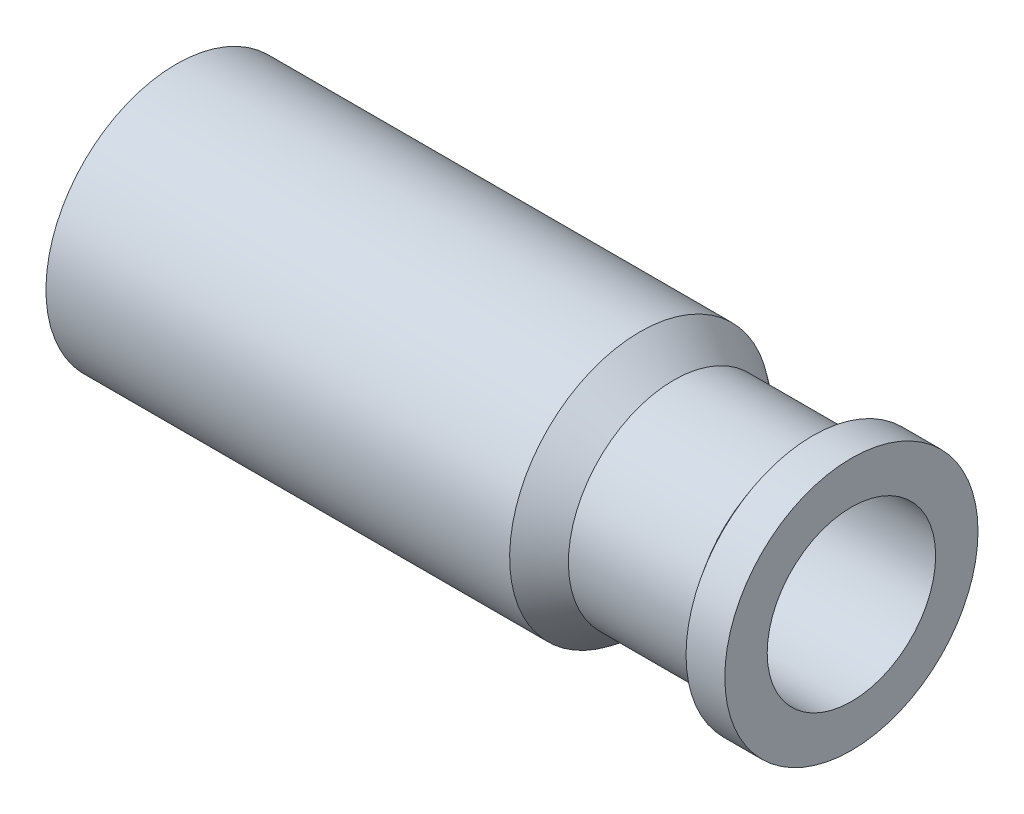
ISO-10303-21;
HEADER;
FILE_DESCRIPTION(('STEP AP214'),'2;1');
FILE_NAME('part.step','',(''),(''),'','','');
FILE_SCHEMA(('AUTOMOTIVE_DESIGN { 1 0 10303 214 1 1 1 1 }'));
ENDSEC;
DATA;
#1=APPLICATION_CONTEXT('core data for automotive mechanical design processes');
#2=APPLICATION_PROTOCOL_DEFINITION('international standard','automotive_design',2000,#1);
#3=PRODUCT_CONTEXT('',#1,'mechanical');
#4=PRODUCT('Part','Part','',(#3));
#5=PRODUCT_RELATED_PRODUCT_CATEGORY('part','',(#4));
#6=PRODUCT_DEFINITION_FORMATION('','',#4);
#7=PRODUCT_DEFINITION_CONTEXT('part definition',#1,'design');
#8=PRODUCT_DEFINITION('design','',#6,#7);
#9=PRODUCT_DEFINITION_SHAPE('','',#8);
#10=(LENGTH_UNIT() NAMED_UNIT(*) SI_UNIT(.MILLI.,.METRE.));
#11=(NAMED_UNIT(*) PLANE_ANGLE_UNIT() SI_UNIT($,.RADIAN.));
#12=(NAMED_UNIT(*) SI_UNIT($,.STERADIAN.) SOLID_ANGLE_UNIT());
#13=UNCERTAINTY_MEASURE_WITH_UNIT(LENGTH_MEASURE(1.E-05),#10,'distance_accuracy_value','');
#14=(GEOMETRIC_REPRESENTATION_CONTEXT(3) GLOBAL_UNCERTAINTY_ASSIGNED_CONTEXT((#13)) GLOBAL_UNIT_ASSIGNED_CONTEXT((#10,
#11,#12)) REPRESENTATION_CONTEXT('',''));
#15=CARTESIAN_POINT('',(0.,0.,0.));
#16=DIRECTION('',(0.,0.,1.));
#17=DIRECTION('',(1.,0.,0.));
#18=AXIS2_PLACEMENT_3D('',#15,#16,#17);
#19=CARTESIAN_POINT('',(171.145497315962,-55.1361493306223,0.));
#20=DIRECTION('',(1.,0.,0.));
#21=DIRECTION('',(0.,1.,0.));
#22=AXIS2_PLACEMENT_3D('',#19,#20,#21);
#23=CYLINDRICAL_SURFACE('',#22,39.2252237368823);
#24=CARTESIAN_POINT('',(-32.0545026840381,-55.1361493306223,0.));
#25=DIRECTION('',(1.,0.,0.));
#26=DIRECTION('',(0.,1.,0.));
#27=AXIS2_PLACEMENT_3D('',#24,#25,#26);
#28=CIRCLE('',#27,39.2252237368825);
#29=CARTESIAN_POINT('',(-32.0545026840381,-15.9109255937398,0.));
#30=VERTEX_POINT('',#29);
#31=EDGE_CURVE('E10',#30,#30,#28,.T.);
#32=ORIENTED_EDGE('',*,*,#31,.T.);
#33=EDGE_LOOP('',(#32));
#34=FACE_BOUND('',#33,.T.);
#35=CARTESIAN_POINT('',(107.503032850586,-55.1361493306223,0.));
#36=DIRECTION('',(1.,0.,0.));
#37=DIRECTION('',(0.,1.,0.));
#38=AXIS2_PLACEMENT_3D('',#35,#36,#37);
#39=CIRCLE('',#38,39.2252237368822);
#40=CARTESIAN_POINT('',(107.503032850586,-15.9109255937401,0.));
#41=VERTEX_POINT('',#40);
#42=EDGE_CURVE('E57',#41,#41,#39,.T.);
#43=ORIENTED_EDGE('',*,*,#42,.F.);
#44=EDGE_LOOP('',(#43));
#45=FACE_BOUND('',#44,.T.);
#46=ADVANCED_FACE('F35',(#34,#45),#23,.T.);
#47=CARTESIAN_POINT('',(-32.0545026840381,-15.9109255937398,0.));
#48=DIRECTION('',(-1.,0.,0.));
#49=DIRECTION('',(0.,-1.,0.));
#50=AXIS2_PLACEMENT_3D('',#47,#48,#49);
#51=PLANE('',#50);
#52=ORIENTED_EDGE('',*,*,#31,.F.);
#53=EDGE_LOOP('',(#52));
#54=FACE_BOUND('',#53,.T.);
#55=ADVANCED_FACE('F79',(#54),#51,.T.);
#56=CARTESIAN_POINT('',(171.145497315962,-17.0361493306223,0.));
#57=DIRECTION('',(1.,0.,0.));
#58=DIRECTION('',(0.,1.,0.));
#59=AXIS2_PLACEMENT_3D('',#56,#57,#58);
#60=PLANE('',#59);
#61=CARTESIAN_POINT('',(171.145497315962,-55.1361493306223,0.));
#62=DIRECTION('',(1.,0.,0.));
#63=DIRECTION('',(0.,1.,0.));
#64=AXIS2_PLACEMENT_3D('',#61,#62,#63);
#65=CIRCLE('',#64,25.3501248235923);
#66=CARTESIAN_POINT('',(171.145497315962,-29.7860245070299,0.));
#67=VERTEX_POINT('',#66);
#68=EDGE_CURVE('E61',#67,#67,#65,.T.);
#69=ORIENTED_EDGE('',*,*,#68,.F.);
#70=EDGE_LOOP('',(#69));
#71=FACE_BOUND('',#70,.T.);
#72=CARTESIAN_POINT('',(171.145497315962,-55.1361493306223,0.));
#73=DIRECTION('',(1.,0.,0.));
#74=DIRECTION('',(0.,1.,0.));
#75=AXIS2_PLACEMENT_3D('',#72,#73,#74);
#76=CIRCLE('',#75,38.1);
#77=CARTESIAN_POINT('',(171.145497315962,-17.0361493306223,0.));
#78=VERTEX_POINT('',#77);
#79=EDGE_CURVE('E41',#78,#78,#76,.T.);
#80=ORIENTED_EDGE('',*,*,#79,.T.);
#81=EDGE_LOOP('',(#80));
#82=FACE_BOUND('',#81,.T.);
#83=ADVANCED_FACE('F76',(#71,#82),#60,.T.);
#84=CARTESIAN_POINT('',(171.145497315962,-55.1361493306223,0.));
#85=DIRECTION('',(1.,0.,0.));
#86=DIRECTION('',(0.,1.,0.));
#87=AXIS2_PLACEMENT_3D('',#84,#85,#86);
#88=CYLINDRICAL_SURFACE('',#87,38.1);
#89=CARTESIAN_POINT('',(159.466804827145,-55.1361493306223,0.));
#90=DIRECTION('',(1.,0.,0.));
#91=DIRECTION('',(0.,1.,0.));
#92=AXIS2_PLACEMENT_3D('',#89,#90,#91);
#93=CIRCLE('',#92,38.1);
#94=CARTESIAN_POINT('',(159.466804827145,-17.0361493306223,0.));
#95=VERTEX_POINT('',#94);
#96=EDGE_CURVE('E45',#95,#95,#93,.T.);
#97=ORIENTED_EDGE('',*,*,#96,.T.);
#98=EDGE_LOOP('',(#97));
#99=FACE_BOUND('',#98,.T.);
#100=ORIENTED_EDGE('',*,*,#79,.F.);
#101=EDGE_LOOP('',(#100));
#102=FACE_BOUND('',#101,.T.);
#103=ADVANCED_FACE('F78',(#99,#102),#88,.T.);
#104=CARTESIAN_POINT('',(159.466804827145,-55.1361493306223,0.));
#105=DIRECTION('',(1.,0.,0.));
#106=DIRECTION('',(0.,1.,0.));
#107=AXIS2_PLACEMENT_3D('',#104,#105,#106);
#108=CONICAL_SURFACE('',#107,38.1,0.93892170214599);
#109=CARTESIAN_POINT('',(154.818669260434,-55.1361493306223,0.));
#110=DIRECTION('',(1.,0.,0.));
#111=DIRECTION('',(0.,1.,0.));
#112=AXIS2_PLACEMENT_3D('',#109,#110,#111);
#113=CIRCLE('',#112,31.75);
#114=CARTESIAN_POINT('',(154.818669260434,-23.3861493306223,0.));
#115=VERTEX_POINT('',#114);
#116=EDGE_CURVE('E49',#115,#115,#113,.T.);
#117=ORIENTED_EDGE('',*,*,#116,.T.);
#118=EDGE_LOOP('',(#117));
#119=FACE_BOUND('',#118,.T.);
#120=ORIENTED_EDGE('',*,*,#96,.F.);
#121=EDGE_LOOP('',(#120));
#122=FACE_BOUND('',#121,.T.);
#123=ADVANCED_FACE('F85',(#119,#122),#108,.T.);
#124=CARTESIAN_POINT('',(171.145497315962,-55.1361493306223,0.));
#125=DIRECTION('',(1.,0.,0.));
#126=DIRECTION('',(0.,1.,0.));
#127=AXIS2_PLACEMENT_3D('',#124,#125,#126);
#128=CYLINDRICAL_SURFACE('',#127,31.75);
#129=CARTESIAN_POINT('',(117.715228697274,-55.1361493306223,0.));
#130=DIRECTION('',(1.,0.,0.));
#131=DIRECTION('',(0.,1.,0.));
#132=AXIS2_PLACEMENT_3D('',#129,#130,#131);
#133=CIRCLE('',#132,31.75);
#134=CARTESIAN_POINT('',(117.715228697274,-23.3861493306223,0.));
#135=VERTEX_POINT('',#134);
#136=EDGE_CURVE('E54',#135,#135,#133,.T.);
#137=ORIENTED_EDGE('',*,*,#136,.T.);
#138=EDGE_LOOP('',(#137));
#139=FACE_BOUND('',#138,.T.);
#140=ORIENTED_EDGE('',*,*,#116,.F.);
#141=EDGE_LOOP('',(#140));
#142=FACE_BOUND('',#141,.T.);
#143=ADVANCED_FACE('F97',(#139,#142),#128,.T.);
#144=CARTESIAN_POINT('',(117.715228697274,-55.1361493306223,0.));
#145=DIRECTION('',(-1.,0.,0.));
#146=DIRECTION('',(0.,-1.,0.));
#147=AXIS2_PLACEMENT_3D('',#144,#145,#146);
#148=CONICAL_SURFACE('',#147,31.75,0.631874624648907);
#149=ORIENTED_EDGE('',*,*,#42,.T.);
#150=EDGE_LOOP('',(#149));
#151=FACE_BOUND('',#150,.T.);
#152=ORIENTED_EDGE('',*,*,#136,.F.);
#153=EDGE_LOOP('',(#152));
#154=FACE_BOUND('',#153,.T.);
#155=ADVANCED_FACE('F72',(#151,#154),#148,.T.);
#156=CARTESIAN_POINT('',(-19.3545026840381,-55.1361493306223,0.));
#157=DIRECTION('',(1.,0.,0.));
#158=DIRECTION('',(0.,1.,0.));
#159=AXIS2_PLACEMENT_3D('',#156,#157,#158);
#160=CYLINDRICAL_SURFACE('',#159,25.3501248235923);
#161=CARTESIAN_POINT('',(-19.3545026840381,-55.1361493306223,0.));
#162=DIRECTION('',(1.,0.,0.));
#163=DIRECTION('',(0.,1.,0.));
#164=AXIS2_PLACEMENT_3D('',#161,#162,#163);
#165=CIRCLE('',#164,25.3501248235923);
#166=CARTESIAN_POINT('',(-19.3545026840381,-29.78602450703,0.));
#167=VERTEX_POINT('',#166);
#168=EDGE_CURVE('E60',#167,#167,#165,.T.);
#169=ORIENTED_EDGE('',*,*,#168,.F.);
#170=EDGE_LOOP('',(#169));
#171=FACE_BOUND('',#170,.T.);
#172=ORIENTED_EDGE('',*,*,#68,.T.);
#173=EDGE_LOOP('',(#172));
#174=FACE_BOUND('',#173,.T.);
#175=ADVANCED_FACE('F69',(#171,#174),#160,.F.);
#176=CARTESIAN_POINT('',(-19.3545026840381,-55.1361493306223,0.));
#177=DIRECTION('',(1.,0.,0.));
#178=DIRECTION('',(0.,1.,0.));
#179=AXIS2_PLACEMENT_3D('',#176,#177,#178);
#180=PLANE('',#179);
#181=ORIENTED_EDGE('',*,*,#168,.T.);
#182=EDGE_LOOP('',(#181));
#183=FACE_BOUND('',#182,.T.);
#184=ADVANCED_FACE('F67',(#183),#180,.T.);
#185=CLOSED_SHELL('',(#46,#55,#83,#103,#123,#143,#155,#175,#184));
#186=MANIFOLD_SOLID_BREP('B2',#185);
#187=ADVANCED_BREP_SHAPE_REPRESENTATION('',(#18,#186),#14);
#188=SHAPE_DEFINITION_REPRESENTATION(#9,#187);
ENDSEC;
END-ISO-10303-21;
